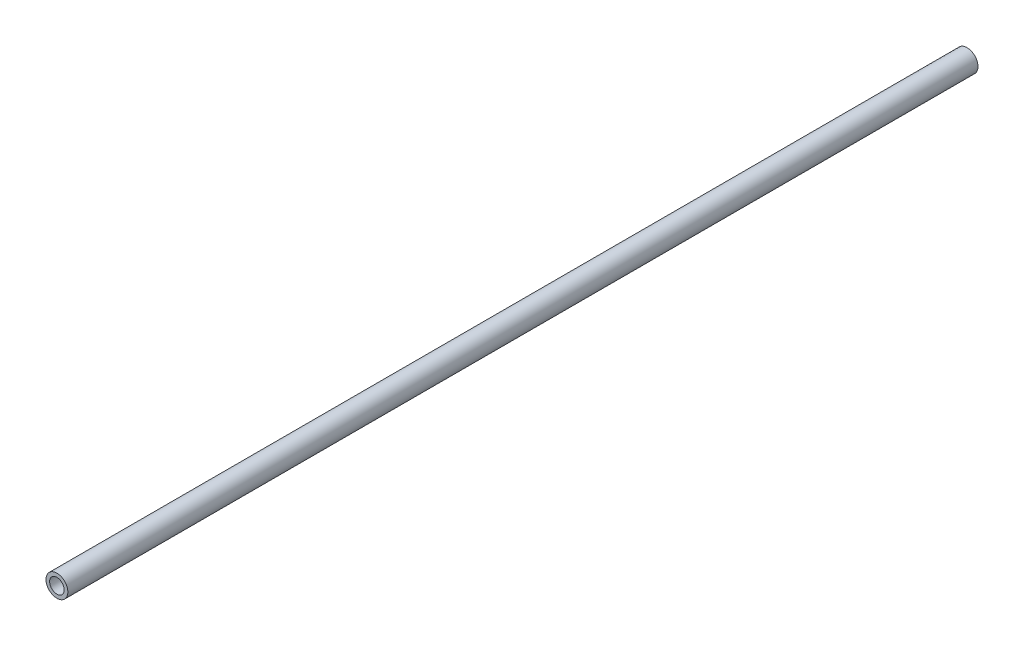
ISO-10303-21;
HEADER;
FILE_DESCRIPTION(('STEP AP214'),'2;1');
FILE_NAME('part.step','',(''),(''),'','','');
FILE_SCHEMA(('AUTOMOTIVE_DESIGN { 1 0 10303 214 1 1 1 1 }'));
ENDSEC;
DATA;
#1=APPLICATION_CONTEXT('core data for automotive mechanical design processes');
#2=APPLICATION_PROTOCOL_DEFINITION('international standard','automotive_design',2000,#1);
#3=PRODUCT_CONTEXT('',#1,'mechanical');
#4=PRODUCT('Part','Part','',(#3));
#5=PRODUCT_RELATED_PRODUCT_CATEGORY('part','',(#4));
#6=PRODUCT_DEFINITION_FORMATION('','',#4);
#7=PRODUCT_DEFINITION_CONTEXT('part definition',#1,'design');
#8=PRODUCT_DEFINITION('design','',#6,#7);
#9=PRODUCT_DEFINITION_SHAPE('','',#8);
#10=(LENGTH_UNIT() NAMED_UNIT(*) SI_UNIT(.MILLI.,.METRE.));
#11=(NAMED_UNIT(*) PLANE_ANGLE_UNIT() SI_UNIT($,.RADIAN.));
#12=(NAMED_UNIT(*) SI_UNIT($,.STERADIAN.) SOLID_ANGLE_UNIT());
#13=UNCERTAINTY_MEASURE_WITH_UNIT(LENGTH_MEASURE(1.E-05),#10,'distance_accuracy_value','');
#14=(GEOMETRIC_REPRESENTATION_CONTEXT(3) GLOBAL_UNCERTAINTY_ASSIGNED_CONTEXT((#13)) GLOBAL_UNIT_ASSIGNED_CONTEXT((#10,
#11,#12)) REPRESENTATION_CONTEXT('',''));
#15=CARTESIAN_POINT('',(0.,0.,0.));
#16=DIRECTION('',(0.,0.,1.));
#17=DIRECTION('',(1.,0.,0.));
#18=AXIS2_PLACEMENT_3D('',#15,#16,#17);
#19=CARTESIAN_POINT('',(0.,0.,250.));
#20=DIRECTION('',(0.,0.,1.));
#21=DIRECTION('',(1.,0.,0.));
#22=AXIS2_PLACEMENT_3D('',#19,#20,#21);
#23=PLANE('',#22);
#24=CARTESIAN_POINT('',(0.,0.,250.));
#25=DIRECTION('',(0.,0.,1.));
#26=DIRECTION('',(1.,0.,0.));
#27=AXIS2_PLACEMENT_3D('',#24,#25,#26);
#28=CIRCLE('',#27,3.);
#29=CARTESIAN_POINT('',(3.,0.,250.));
#30=VERTEX_POINT('',#29);
#31=EDGE_CURVE('E10',#30,#30,#28,.T.);
#32=ORIENTED_EDGE('',*,*,#31,.T.);
#33=EDGE_LOOP('',(#32));
#34=FACE_BOUND('',#33,.T.);
#35=CARTESIAN_POINT('',(0.,0.,250.));
#36=DIRECTION('',(0.,0.,1.));
#37=DIRECTION('',(1.,0.,0.));
#38=AXIS2_PLACEMENT_3D('',#35,#36,#37);
#39=CIRCLE('',#38,2.);
#40=CARTESIAN_POINT('',(2.,0.,250.));
#41=VERTEX_POINT('',#40);
#42=EDGE_CURVE('E41',#41,#41,#39,.T.);
#43=ORIENTED_EDGE('',*,*,#42,.F.);
#44=EDGE_LOOP('',(#43));
#45=FACE_BOUND('',#44,.T.);
#46=ADVANCED_FACE('F30',(#34,#45),#23,.T.);
#47=CARTESIAN_POINT('',(0.,0.,0.));
#48=DIRECTION('',(0.,0.,1.));
#49=DIRECTION('',(1.,0.,0.));
#50=AXIS2_PLACEMENT_3D('',#47,#48,#49);
#51=PLANE('',#50);
#52=CARTESIAN_POINT('',(0.,0.,0.));
#53=DIRECTION('',(0.,0.,1.));
#54=DIRECTION('',(1.,0.,0.));
#55=AXIS2_PLACEMENT_3D('',#52,#53,#54);
#56=CIRCLE('',#55,3.);
#57=CARTESIAN_POINT('',(3.,0.,0.));
#58=VERTEX_POINT('',#57);
#59=EDGE_CURVE('E34',#58,#58,#56,.T.);
#60=ORIENTED_EDGE('',*,*,#59,.F.);
#61=EDGE_LOOP('',(#60));
#62=FACE_BOUND('',#61,.T.);
#63=CARTESIAN_POINT('',(0.,0.,0.));
#64=DIRECTION('',(0.,0.,1.));
#65=DIRECTION('',(1.,0.,0.));
#66=AXIS2_PLACEMENT_3D('',#63,#64,#65);
#67=CIRCLE('',#66,2.);
#68=CARTESIAN_POINT('',(2.,0.,0.));
#69=VERTEX_POINT('',#68);
#70=EDGE_CURVE('E43',#69,#69,#67,.T.);
#71=ORIENTED_EDGE('',*,*,#70,.T.);
#72=EDGE_LOOP('',(#71));
#73=FACE_BOUND('',#72,.T.);
#74=ADVANCED_FACE('F53',(#62,#73),#51,.F.);
#75=CARTESIAN_POINT('',(0.,0.,250.));
#76=DIRECTION('',(0.,0.,-1.));
#77=DIRECTION('',(-1.,0.,0.));
#78=AXIS2_PLACEMENT_3D('',#75,#76,#77);
#79=CYLINDRICAL_SURFACE('',#78,3.);
#80=ORIENTED_EDGE('',*,*,#31,.F.);
#81=EDGE_LOOP('',(#80));
#82=FACE_BOUND('',#81,.T.);
#83=ORIENTED_EDGE('',*,*,#59,.T.);
#84=EDGE_LOOP('',(#83));
#85=FACE_BOUND('',#84,.T.);
#86=ADVANCED_FACE('F32',(#82,#85),#79,.T.);
#87=CARTESIAN_POINT('',(0.,0.,250.));
#88=DIRECTION('',(0.,0.,-1.));
#89=DIRECTION('',(-1.,0.,0.));
#90=AXIS2_PLACEMENT_3D('',#87,#88,#89);
#91=CYLINDRICAL_SURFACE('',#90,2.);
#92=ORIENTED_EDGE('',*,*,#42,.T.);
#93=EDGE_LOOP('',(#92));
#94=FACE_BOUND('',#93,.T.);
#95=ORIENTED_EDGE('',*,*,#70,.F.);
#96=EDGE_LOOP('',(#95));
#97=FACE_BOUND('',#96,.T.);
#98=ADVANCED_FACE('F49',(#94,#97),#91,.F.);
#99=CLOSED_SHELL('',(#46,#74,#86,#98));
#100=MANIFOLD_SOLID_BREP('B2',#99);
#101=ADVANCED_BREP_SHAPE_REPRESENTATION('',(#18,#100),#14);
#102=SHAPE_DEFINITION_REPRESENTATION(#9,#101);
ENDSEC;
END-ISO-10303-21;
